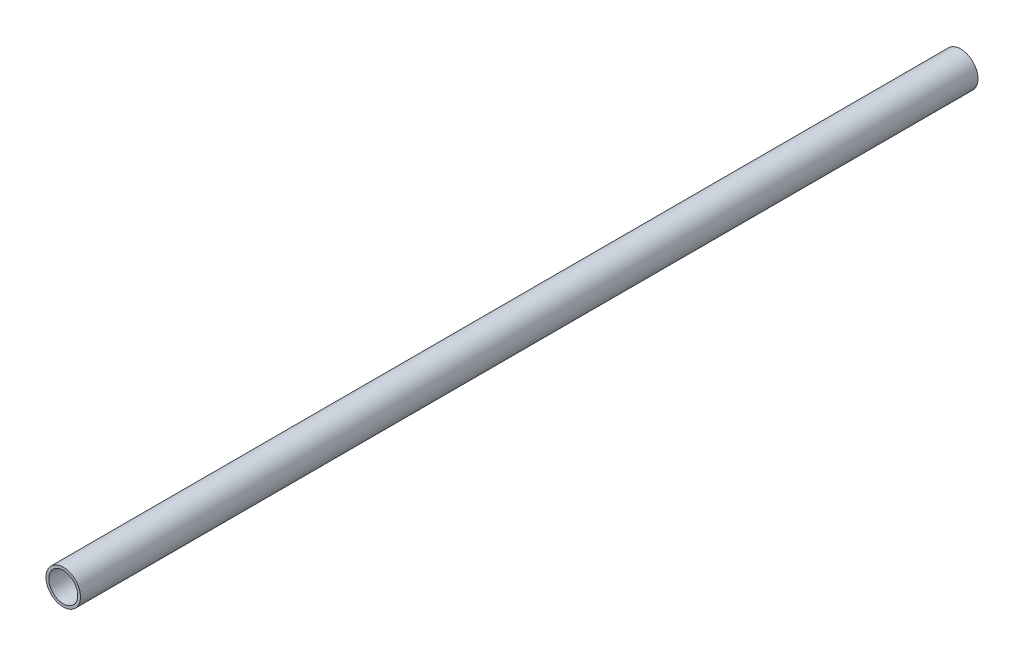
ISO-10303-21;
HEADER;
FILE_DESCRIPTION(('STEP AP214'),'2;1');
FILE_NAME('part.step','',(''),(''),'','','');
FILE_SCHEMA(('AUTOMOTIVE_DESIGN { 1 0 10303 214 1 1 1 1 }'));
ENDSEC;
DATA;
#1=APPLICATION_CONTEXT('core data for automotive mechanical design processes');
#2=APPLICATION_PROTOCOL_DEFINITION('international standard','automotive_design',2000,#1);
#3=PRODUCT_CONTEXT('',#1,'mechanical');
#4=PRODUCT('Part','Part','',(#3));
#5=PRODUCT_RELATED_PRODUCT_CATEGORY('part','',(#4));
#6=PRODUCT_DEFINITION_FORMATION('','',#4);
#7=PRODUCT_DEFINITION_CONTEXT('part definition',#1,'design');
#8=PRODUCT_DEFINITION('design','',#6,#7);
#9=PRODUCT_DEFINITION_SHAPE('','',#8);
#10=(LENGTH_UNIT() NAMED_UNIT(*) SI_UNIT(.MILLI.,.METRE.));
#11=(NAMED_UNIT(*) PLANE_ANGLE_UNIT() SI_UNIT($,.RADIAN.));
#12=(NAMED_UNIT(*) SI_UNIT($,.STERADIAN.) SOLID_ANGLE_UNIT());
#13=UNCERTAINTY_MEASURE_WITH_UNIT(LENGTH_MEASURE(1.E-05),#10,'distance_accuracy_value','');
#14=(GEOMETRIC_REPRESENTATION_CONTEXT(3) GLOBAL_UNCERTAINTY_ASSIGNED_CONTEXT((#13)) GLOBAL_UNIT_ASSIGNED_CONTEXT((#10,
#11,#12)) REPRESENTATION_CONTEXT('',''));
#15=CARTESIAN_POINT('',(0.,0.,0.));
#16=DIRECTION('',(0.,0.,1.));
#17=DIRECTION('',(1.,0.,0.));
#18=AXIS2_PLACEMENT_3D('',#15,#16,#17);
#19=CARTESIAN_POINT('',(0.,0.,650.));
#20=DIRECTION('',(0.,0.,1.));
#21=DIRECTION('',(1.,0.,0.));
#22=AXIS2_PLACEMENT_3D('',#19,#20,#21);
#23=PLANE('',#22);
#24=CARTESIAN_POINT('',(0.,0.,650.));
#25=DIRECTION('',(0.,0.,1.));
#26=DIRECTION('',(1.,0.,0.));
#27=AXIS2_PLACEMENT_3D('',#24,#25,#26);
#28=CIRCLE('',#27,12.5);
#29=CARTESIAN_POINT('',(12.5,0.,650.));
#30=VERTEX_POINT('',#29);
#31=EDGE_CURVE('E10',#30,#30,#28,.T.);
#32=ORIENTED_EDGE('',*,*,#31,.T.);
#33=EDGE_LOOP('',(#32));
#34=FACE_BOUND('',#33,.T.);
#35=CARTESIAN_POINT('',(0.,0.,650.));
#36=DIRECTION('',(0.,0.,1.));
#37=DIRECTION('',(1.,0.,0.));
#38=AXIS2_PLACEMENT_3D('',#35,#36,#37);
#39=CIRCLE('',#38,10.5);
#40=CARTESIAN_POINT('',(10.5,0.,650.));
#41=VERTEX_POINT('',#40);
#42=EDGE_CURVE('E42',#41,#41,#39,.T.);
#43=ORIENTED_EDGE('',*,*,#42,.F.);
#44=EDGE_LOOP('',(#43));
#45=FACE_BOUND('',#44,.T.);
#46=ADVANCED_FACE('F31',(#34,#45),#23,.T.);
#47=CARTESIAN_POINT('',(0.,0.,0.));
#48=DIRECTION('',(0.,0.,1.));
#49=DIRECTION('',(1.,0.,0.));
#50=AXIS2_PLACEMENT_3D('',#47,#48,#49);
#51=PLANE('',#50);
#52=CARTESIAN_POINT('',(0.,0.,0.));
#53=DIRECTION('',(0.,0.,1.));
#54=DIRECTION('',(1.,0.,0.));
#55=AXIS2_PLACEMENT_3D('',#52,#53,#54);
#56=CIRCLE('',#55,12.5);
#57=CARTESIAN_POINT('',(12.5,0.,0.));
#58=VERTEX_POINT('',#57);
#59=EDGE_CURVE('E35',#58,#58,#56,.T.);
#60=ORIENTED_EDGE('',*,*,#59,.F.);
#61=EDGE_LOOP('',(#60));
#62=FACE_BOUND('',#61,.T.);
#63=CARTESIAN_POINT('',(0.,0.,0.));
#64=DIRECTION('',(0.,0.,1.));
#65=DIRECTION('',(1.,0.,0.));
#66=AXIS2_PLACEMENT_3D('',#63,#64,#65);
#67=CIRCLE('',#66,10.5);
#68=CARTESIAN_POINT('',(10.5,0.,0.));
#69=VERTEX_POINT('',#68);
#70=EDGE_CURVE('E44',#69,#69,#67,.T.);
#71=ORIENTED_EDGE('',*,*,#70,.T.);
#72=EDGE_LOOP('',(#71));
#73=FACE_BOUND('',#72,.T.);
#74=ADVANCED_FACE('F54',(#62,#73),#51,.F.);
#75=CARTESIAN_POINT('',(0.,0.,650.));
#76=DIRECTION('',(0.,0.,-1.));
#77=DIRECTION('',(-1.,0.,0.));
#78=AXIS2_PLACEMENT_3D('',#75,#76,#77);
#79=CYLINDRICAL_SURFACE('',#78,12.5);
#80=ORIENTED_EDGE('',*,*,#31,.F.);
#81=EDGE_LOOP('',(#80));
#82=FACE_BOUND('',#81,.T.);
#83=ORIENTED_EDGE('',*,*,#59,.T.);
#84=EDGE_LOOP('',(#83));
#85=FACE_BOUND('',#84,.T.);
#86=ADVANCED_FACE('F33',(#82,#85),#79,.T.);
#87=CARTESIAN_POINT('',(0.,0.,650.));
#88=DIRECTION('',(0.,0.,-1.));
#89=DIRECTION('',(-1.,0.,0.));
#90=AXIS2_PLACEMENT_3D('',#87,#88,#89);
#91=CYLINDRICAL_SURFACE('',#90,10.5);
#92=ORIENTED_EDGE('',*,*,#42,.T.);
#93=EDGE_LOOP('',(#92));
#94=FACE_BOUND('',#93,.T.);
#95=ORIENTED_EDGE('',*,*,#70,.F.);
#96=EDGE_LOOP('',(#95));
#97=FACE_BOUND('',#96,.T.);
#98=ADVANCED_FACE('F50',(#94,#97),#91,.F.);
#99=CLOSED_SHELL('',(#46,#74,#86,#98));
#100=MANIFOLD_SOLID_BREP('B2',#99);
#101=ADVANCED_BREP_SHAPE_REPRESENTATION('',(#18,#100),#14);
#102=SHAPE_DEFINITION_REPRESENTATION(#9,#101);
ENDSEC;
END-ISO-10303-21;
